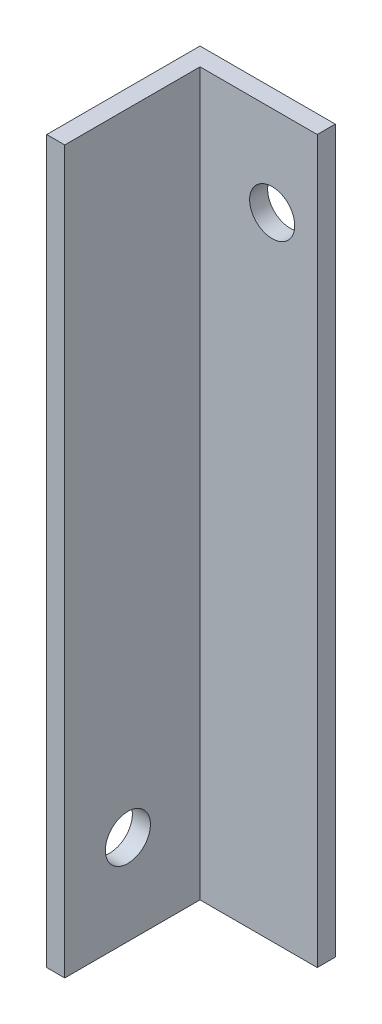
ISO-10303-21;
HEADER;
FILE_DESCRIPTION(('STEP AP214'),'2;1');
FILE_NAME('part.step','',(''),(''),'','','');
FILE_SCHEMA(('AUTOMOTIVE_DESIGN { 1 0 10303 214 1 1 1 1 }'));
ENDSEC;
DATA;
#1=APPLICATION_CONTEXT('core data for automotive mechanical design processes');
#2=APPLICATION_PROTOCOL_DEFINITION('international standard','automotive_design',2000,#1);
#3=PRODUCT_CONTEXT('',#1,'mechanical');
#4=PRODUCT('Part','Part','',(#3));
#5=PRODUCT_RELATED_PRODUCT_CATEGORY('part','',(#4));
#6=PRODUCT_DEFINITION_FORMATION('','',#4);
#7=PRODUCT_DEFINITION_CONTEXT('part definition',#1,'design');
#8=PRODUCT_DEFINITION('design','',#6,#7);
#9=PRODUCT_DEFINITION_SHAPE('','',#8);
#10=(LENGTH_UNIT() NAMED_UNIT(*) SI_UNIT(.MILLI.,.METRE.));
#11=(NAMED_UNIT(*) PLANE_ANGLE_UNIT() SI_UNIT($,.RADIAN.));
#12=(NAMED_UNIT(*) SI_UNIT($,.STERADIAN.) SOLID_ANGLE_UNIT());
#13=UNCERTAINTY_MEASURE_WITH_UNIT(LENGTH_MEASURE(1.E-05),#10,'distance_accuracy_value','');
#14=(GEOMETRIC_REPRESENTATION_CONTEXT(3) GLOBAL_UNCERTAINTY_ASSIGNED_CONTEXT((#13)) GLOBAL_UNIT_ASSIGNED_CONTEXT((#10,
#11,#12)) REPRESENTATION_CONTEXT('',''));
#15=CARTESIAN_POINT('',(0.,0.,0.));
#16=DIRECTION('',(0.,0.,1.));
#17=DIRECTION('',(1.,0.,0.));
#18=AXIS2_PLACEMENT_3D('',#15,#16,#17);
#19=CARTESIAN_POINT('',(0.,0.,2.));
#20=DIRECTION('',(1.,0.,0.));
#21=DIRECTION('',(0.,1.,0.));
#22=AXIS2_PLACEMENT_3D('',#19,#20,#21);
#23=PLANE('',#22);
#24=CARTESIAN_POINT('',(0.,-70.,10.));
#25=DIRECTION('',(-1.,0.,0.));
#26=DIRECTION('',(0.,-1.,0.));
#27=AXIS2_PLACEMENT_3D('',#24,#25,#26);
#28=CIRCLE('',#27,2.5);
#29=CARTESIAN_POINT('',(0.,-72.5,10.));
#30=VERTEX_POINT('',#29);
#31=EDGE_CURVE('E148',#30,#30,#28,.T.);
#32=ORIENTED_EDGE('',*,*,#31,.F.);
#33=EDGE_LOOP('',(#32));
#34=FACE_BOUND('',#33,.T.);
#35=DIRECTION('',(0.,-1.,0.));
#36=VECTOR('',#35,1.);
#37=CARTESIAN_POINT('',(0.,0.,0.));
#38=LINE('',#37,#36);
#39=CARTESIAN_POINT('',(0.,0.,0.));
#40=VERTEX_POINT('',#39);
#41=CARTESIAN_POINT('',(0.,-80.,0.));
#42=VERTEX_POINT('',#41);
#43=EDGE_CURVE('E93',#40,#42,#38,.T.);
#44=ORIENTED_EDGE('',*,*,#43,.T.);
#45=DIRECTION('',(0.,0.,-1.));
#46=VECTOR('',#45,1.);
#47=CARTESIAN_POINT('',(0.,-80.,2.));
#48=LINE('',#47,#46);
#49=CARTESIAN_POINT('',(0.,-80.,17.));
#50=VERTEX_POINT('',#49);
#51=EDGE_CURVE('E11',#50,#42,#48,.T.);
#52=ORIENTED_EDGE('',*,*,#51,.F.);
#53=DIRECTION('',(0.,-1.,0.));
#54=VECTOR('',#53,1.);
#55=CARTESIAN_POINT('',(0.,0.,17.));
#56=LINE('',#55,#54);
#57=CARTESIAN_POINT('',(0.,0.,17.));
#58=VERTEX_POINT('',#57);
#59=EDGE_CURVE('E95',#58,#50,#56,.T.);
#60=ORIENTED_EDGE('',*,*,#59,.F.);
#61=DIRECTION('',(0.,0.,-1.));
#62=VECTOR('',#61,1.);
#63=CARTESIAN_POINT('',(0.,0.,2.));
#64=LINE('',#63,#62);
#65=EDGE_CURVE('E79',#58,#40,#64,.T.);
#66=ORIENTED_EDGE('',*,*,#65,.T.);
#67=EDGE_LOOP('',(#44,#52,#60,#66));
#68=FACE_BOUND('',#67,.T.);
#69=ADVANCED_FACE('F33',(#34,#68),#23,.F.);
#70=CARTESIAN_POINT('',(0.,-80.,2.));
#71=DIRECTION('',(0.,1.,0.));
#72=DIRECTION('',(0.,0.,1.));
#73=AXIS2_PLACEMENT_3D('',#70,#71,#72);
#74=PLANE('',#73);
#75=DIRECTION('',(1.,0.,0.));
#76=VECTOR('',#75,1.);
#77=CARTESIAN_POINT('',(0.,-80.,0.));
#78=LINE('',#77,#76);
#79=CARTESIAN_POINT('',(15.,-80.,0.));
#80=VERTEX_POINT('',#79);
#81=EDGE_CURVE('E99',#42,#80,#78,.T.);
#82=ORIENTED_EDGE('',*,*,#81,.T.);
#83=DIRECTION('',(0.,0.,-1.));
#84=VECTOR('',#83,1.);
#85=CARTESIAN_POINT('',(15.,-80.,2.));
#86=LINE('',#85,#84);
#87=CARTESIAN_POINT('',(15.,-80.,2.));
#88=VERTEX_POINT('',#87);
#89=EDGE_CURVE('E41',#88,#80,#86,.T.);
#90=ORIENTED_EDGE('',*,*,#89,.F.);
#91=DIRECTION('',(1.,0.,0.));
#92=VECTOR('',#91,1.);
#93=CARTESIAN_POINT('',(0.,-80.,2.));
#94=LINE('',#93,#92);
#95=CARTESIAN_POINT('',(2.00000000000001,-80.,2.));
#96=VERTEX_POINT('',#95);
#97=EDGE_CURVE('E86',#96,#88,#94,.T.);
#98=ORIENTED_EDGE('',*,*,#97,.F.);
#99=DIRECTION('',(0.,0.,-1.));
#100=VECTOR('',#99,1.);
#101=CARTESIAN_POINT('',(2.00000000000001,-80.,17.));
#102=LINE('',#101,#100);
#103=CARTESIAN_POINT('',(2.00000000000001,-80.,17.));
#104=VERTEX_POINT('',#103);
#105=EDGE_CURVE('E100',#104,#96,#102,.T.);
#106=ORIENTED_EDGE('',*,*,#105,.F.);
#107=DIRECTION('',(1.,0.,0.));
#108=VECTOR('',#107,1.);
#109=CARTESIAN_POINT('',(0.,-80.,17.));
#110=LINE('',#109,#108);
#111=EDGE_CURVE('E152',#50,#104,#110,.T.);
#112=ORIENTED_EDGE('',*,*,#111,.F.);
#113=ORIENTED_EDGE('',*,*,#51,.T.);
#114=EDGE_LOOP('',(#82,#90,#98,#106,#112,#113));
#115=FACE_BOUND('',#114,.T.);
#116=ADVANCED_FACE('F165',(#115),#74,.F.);
#117=CARTESIAN_POINT('',(15.,0.,2.));
#118=DIRECTION('',(-1.,0.,0.));
#119=DIRECTION('',(0.,-1.,0.));
#120=AXIS2_PLACEMENT_3D('',#117,#118,#119);
#121=PLANE('',#120);
#122=DIRECTION('',(0.,1.,0.));
#123=VECTOR('',#122,1.);
#124=CARTESIAN_POINT('',(15.,0.,0.));
#125=LINE('',#124,#123);
#126=CARTESIAN_POINT('',(15.,0.,0.));
#127=VERTEX_POINT('',#126);
#128=EDGE_CURVE('E87',#80,#127,#125,.T.);
#129=ORIENTED_EDGE('',*,*,#128,.T.);
#130=DIRECTION('',(0.,0.,-1.));
#131=VECTOR('',#130,1.);
#132=CARTESIAN_POINT('',(15.,0.,2.));
#133=LINE('',#132,#131);
#134=CARTESIAN_POINT('',(15.,0.,2.));
#135=VERTEX_POINT('',#134);
#136=EDGE_CURVE('E82',#135,#127,#133,.T.);
#137=ORIENTED_EDGE('',*,*,#136,.F.);
#138=DIRECTION('',(0.,1.,0.));
#139=VECTOR('',#138,1.);
#140=CARTESIAN_POINT('',(15.,0.,2.));
#141=LINE('',#140,#139);
#142=EDGE_CURVE('E55',#88,#135,#141,.T.);
#143=ORIENTED_EDGE('',*,*,#142,.F.);
#144=ORIENTED_EDGE('',*,*,#89,.T.);
#145=EDGE_LOOP('',(#129,#137,#143,#144));
#146=FACE_BOUND('',#145,.T.);
#147=ADVANCED_FACE('F168',(#146),#121,.F.);
#148=CARTESIAN_POINT('',(0.,0.,2.));
#149=DIRECTION('',(0.,-1.,0.));
#150=DIRECTION('',(0.,0.,-1.));
#151=AXIS2_PLACEMENT_3D('',#148,#149,#150);
#152=PLANE('',#151);
#153=DIRECTION('',(-1.,0.,0.));
#154=VECTOR('',#153,1.);
#155=CARTESIAN_POINT('',(0.,0.,0.));
#156=LINE('',#155,#154);
#157=EDGE_CURVE('E75',#127,#40,#156,.T.);
#158=ORIENTED_EDGE('',*,*,#157,.T.);
#159=ORIENTED_EDGE('',*,*,#65,.F.);
#160=DIRECTION('',(-1.,0.,0.));
#161=VECTOR('',#160,1.);
#162=CARTESIAN_POINT('',(0.,0.,17.));
#163=LINE('',#162,#161);
#164=CARTESIAN_POINT('',(2.,0.,17.));
#165=VERTEX_POINT('',#164);
#166=EDGE_CURVE('E132',#165,#58,#163,.T.);
#167=ORIENTED_EDGE('',*,*,#166,.F.);
#168=DIRECTION('',(0.,0.,-1.));
#169=VECTOR('',#168,1.);
#170=CARTESIAN_POINT('',(2.,0.,17.));
#171=LINE('',#170,#169);
#172=CARTESIAN_POINT('',(2.,0.,2.));
#173=VERTEX_POINT('',#172);
#174=EDGE_CURVE('E104',#165,#173,#171,.T.);
#175=ORIENTED_EDGE('',*,*,#174,.T.);
#176=DIRECTION('',(-1.,0.,0.));
#177=VECTOR('',#176,1.);
#178=CARTESIAN_POINT('',(0.,0.,2.));
#179=LINE('',#178,#177);
#180=EDGE_CURVE('E96',#135,#173,#179,.T.);
#181=ORIENTED_EDGE('',*,*,#180,.F.);
#182=ORIENTED_EDGE('',*,*,#136,.T.);
#183=EDGE_LOOP('',(#158,#159,#167,#175,#181,#182));
#184=FACE_BOUND('',#183,.T.);
#185=ADVANCED_FACE('F77',(#184),#152,.F.);
#186=CARTESIAN_POINT('',(0.,0.,2.));
#187=DIRECTION('',(0.,0.,1.));
#188=DIRECTION('',(1.,0.,0.));
#189=AXIS2_PLACEMENT_3D('',#186,#187,#188);
#190=PLANE('',#189);
#191=CARTESIAN_POINT('',(10.,-9.99999999999999,2.));
#192=DIRECTION('',(0.,0.,1.));
#193=DIRECTION('',(1.,0.,0.));
#194=AXIS2_PLACEMENT_3D('',#191,#192,#193);
#195=CIRCLE('',#194,2.5);
#196=CARTESIAN_POINT('',(12.5,-9.99999999999999,2.));
#197=VERTEX_POINT('',#196);
#198=EDGE_CURVE('E140',#197,#197,#195,.T.);
#199=ORIENTED_EDGE('',*,*,#198,.F.);
#200=EDGE_LOOP('',(#199));
#201=FACE_BOUND('',#200,.T.);
#202=DIRECTION('',(0.,1.,0.));
#203=VECTOR('',#202,1.);
#204=CARTESIAN_POINT('',(2.,0.,2.));
#205=LINE('',#204,#203);
#206=EDGE_CURVE('E49',#96,#173,#205,.T.);
#207=ORIENTED_EDGE('',*,*,#206,.F.);
#208=ORIENTED_EDGE('',*,*,#97,.T.);
#209=ORIENTED_EDGE('',*,*,#142,.T.);
#210=ORIENTED_EDGE('',*,*,#180,.T.);
#211=EDGE_LOOP('',(#207,#208,#209,#210));
#212=FACE_BOUND('',#211,.T.);
#213=ADVANCED_FACE('F122',(#201,#212),#190,.T.);
#214=CARTESIAN_POINT('',(0.,0.,0.));
#215=DIRECTION('',(0.,0.,1.));
#216=DIRECTION('',(1.,0.,0.));
#217=AXIS2_PLACEMENT_3D('',#214,#215,#216);
#218=PLANE('',#217);
#219=CARTESIAN_POINT('',(10.,-9.99999999999999,0.));
#220=DIRECTION('',(0.,0.,1.));
#221=DIRECTION('',(1.,0.,0.));
#222=AXIS2_PLACEMENT_3D('',#219,#220,#221);
#223=CIRCLE('',#222,2.5);
#224=CARTESIAN_POINT('',(12.5,-9.99999999999999,0.));
#225=VERTEX_POINT('',#224);
#226=EDGE_CURVE('E131',#225,#225,#223,.T.);
#227=ORIENTED_EDGE('',*,*,#226,.T.);
#228=EDGE_LOOP('',(#227));
#229=FACE_BOUND('',#228,.T.);
#230=ORIENTED_EDGE('',*,*,#43,.F.);
#231=ORIENTED_EDGE('',*,*,#157,.F.);
#232=ORIENTED_EDGE('',*,*,#128,.F.);
#233=ORIENTED_EDGE('',*,*,#81,.F.);
#234=EDGE_LOOP('',(#230,#231,#232,#233));
#235=FACE_BOUND('',#234,.T.);
#236=ADVANCED_FACE('F98',(#229,#235),#218,.F.);
#237=CARTESIAN_POINT('',(2.,0.,17.));
#238=DIRECTION('',(-1.,0.,0.));
#239=DIRECTION('',(0.,-1.,0.));
#240=AXIS2_PLACEMENT_3D('',#237,#238,#239);
#241=PLANE('',#240);
#242=CARTESIAN_POINT('',(2.00000000000001,-70.,10.));
#243=DIRECTION('',(-1.,0.,0.));
#244=DIRECTION('',(0.,-1.,0.));
#245=AXIS2_PLACEMENT_3D('',#242,#243,#244);
#246=CIRCLE('',#245,2.5);
#247=CARTESIAN_POINT('',(2.00000000000001,-72.5,10.));
#248=VERTEX_POINT('',#247);
#249=EDGE_CURVE('E36',#248,#248,#246,.T.);
#250=ORIENTED_EDGE('',*,*,#249,.T.);
#251=EDGE_LOOP('',(#250));
#252=FACE_BOUND('',#251,.T.);
#253=ORIENTED_EDGE('',*,*,#206,.T.);
#254=ORIENTED_EDGE('',*,*,#174,.F.);
#255=DIRECTION('',(0.,1.,0.));
#256=VECTOR('',#255,1.);
#257=CARTESIAN_POINT('',(2.,0.,17.));
#258=LINE('',#257,#256);
#259=EDGE_CURVE('E134',#104,#165,#258,.T.);
#260=ORIENTED_EDGE('',*,*,#259,.F.);
#261=ORIENTED_EDGE('',*,*,#105,.T.);
#262=EDGE_LOOP('',(#253,#254,#260,#261));
#263=FACE_BOUND('',#262,.T.);
#264=ADVANCED_FACE('F127',(#252,#263),#241,.F.);
#265=CARTESIAN_POINT('',(0.,0.,17.));
#266=DIRECTION('',(0.,0.,1.));
#267=DIRECTION('',(1.,0.,0.));
#268=AXIS2_PLACEMENT_3D('',#265,#266,#267);
#269=PLANE('',#268);
#270=ORIENTED_EDGE('',*,*,#59,.T.);
#271=ORIENTED_EDGE('',*,*,#111,.T.);
#272=ORIENTED_EDGE('',*,*,#259,.T.);
#273=ORIENTED_EDGE('',*,*,#166,.T.);
#274=EDGE_LOOP('',(#270,#271,#272,#273));
#275=FACE_BOUND('',#274,.T.);
#276=ADVANCED_FACE('F157',(#275),#269,.T.);
#277=CARTESIAN_POINT('',(10.,-9.99999999999999,-18.));
#278=DIRECTION('',(0.,0.,1.));
#279=DIRECTION('',(1.,0.,0.));
#280=AXIS2_PLACEMENT_3D('',#277,#278,#279);
#281=CYLINDRICAL_SURFACE('',#280,2.5);
#282=ORIENTED_EDGE('',*,*,#198,.T.);
#283=EDGE_LOOP('',(#282));
#284=FACE_BOUND('',#283,.T.);
#285=ORIENTED_EDGE('',*,*,#226,.F.);
#286=EDGE_LOOP('',(#285));
#287=FACE_BOUND('',#286,.T.);
#288=ADVANCED_FACE('F186',(#284,#287),#281,.F.);
#289=CARTESIAN_POINT('',(20.,-70.,10.));
#290=DIRECTION('',(-1.,0.,0.));
#291=DIRECTION('',(0.,-1.,0.));
#292=AXIS2_PLACEMENT_3D('',#289,#290,#291);
#293=CYLINDRICAL_SURFACE('',#292,2.5);
#294=ORIENTED_EDGE('',*,*,#31,.T.);
#295=EDGE_LOOP('',(#294));
#296=FACE_BOUND('',#295,.T.);
#297=ORIENTED_EDGE('',*,*,#249,.F.);
#298=EDGE_LOOP('',(#297));
#299=FACE_BOUND('',#298,.T.);
#300=ADVANCED_FACE('F183',(#296,#299),#293,.F.);
#301=CLOSED_SHELL('',(#69,#116,#147,#185,#213,#236,#264,#276,#288,#300));
#302=MANIFOLD_SOLID_BREP('B2',#301);
#303=ADVANCED_BREP_SHAPE_REPRESENTATION('',(#18,#302),#14);
#304=SHAPE_DEFINITION_REPRESENTATION(#9,#303);
ENDSEC;
END-ISO-10303-21;
